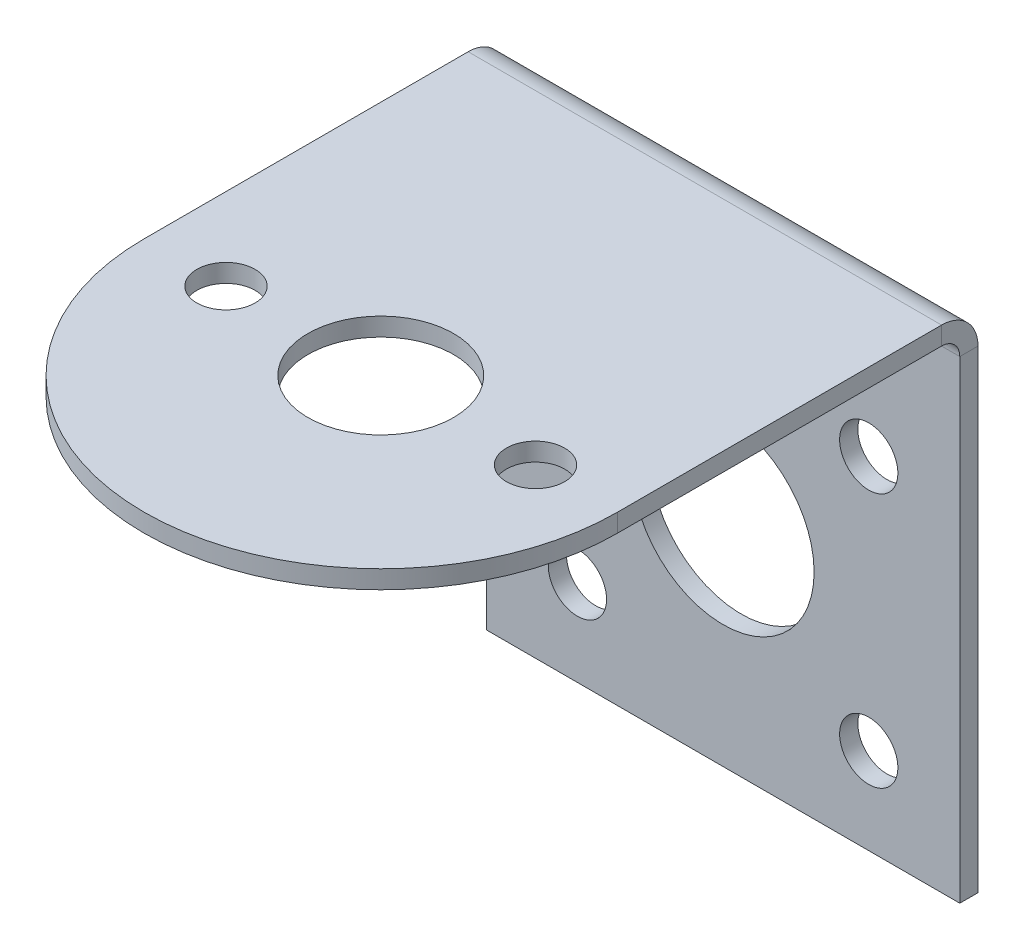
ISO-10303-21;
HEADER;
FILE_DESCRIPTION(('STEP AP214'),'2;1');
FILE_NAME('part.step','',(''),(''),'','','');
FILE_SCHEMA(('AUTOMOTIVE_DESIGN { 1 0 10303 214 1 1 1 1 }'));
ENDSEC;
DATA;
#1=APPLICATION_CONTEXT('core data for automotive mechanical design processes');
#2=APPLICATION_PROTOCOL_DEFINITION('international standard','automotive_design',2000,#1);
#3=PRODUCT_CONTEXT('',#1,'mechanical');
#4=PRODUCT('Part','Part','',(#3));
#5=PRODUCT_RELATED_PRODUCT_CATEGORY('part','',(#4));
#6=PRODUCT_DEFINITION_FORMATION('','',#4);
#7=PRODUCT_DEFINITION_CONTEXT('part definition',#1,'design');
#8=PRODUCT_DEFINITION('design','',#6,#7);
#9=PRODUCT_DEFINITION_SHAPE('','',#8);
#10=(LENGTH_UNIT() NAMED_UNIT(*) SI_UNIT(.MILLI.,.METRE.));
#11=(NAMED_UNIT(*) PLANE_ANGLE_UNIT() SI_UNIT($,.RADIAN.));
#12=(NAMED_UNIT(*) SI_UNIT($,.STERADIAN.) SOLID_ANGLE_UNIT());
#13=UNCERTAINTY_MEASURE_WITH_UNIT(LENGTH_MEASURE(1.E-05),#10,'distance_accuracy_value','');
#14=(GEOMETRIC_REPRESENTATION_CONTEXT(3) GLOBAL_UNCERTAINTY_ASSIGNED_CONTEXT((#13)) GLOBAL_UNIT_ASSIGNED_CONTEXT((#10,
#11,#12)) REPRESENTATION_CONTEXT('',''));
#15=CARTESIAN_POINT('',(0.,0.,0.));
#16=DIRECTION('',(0.,0.,1.));
#17=DIRECTION('',(1.,0.,0.));
#18=AXIS2_PLACEMENT_3D('',#15,#16,#17);
#19=CARTESIAN_POINT('',(0.,2.,19.8008851424871));
#20=DIRECTION('',(0.,-1.,0.));
#21=DIRECTION('',(-1.,0.,0.));
#22=AXIS2_PLACEMENT_3D('',#19,#20,#21);
#23=CYLINDRICAL_SURFACE('',#22,4.);
#24=CARTESIAN_POINT('',(0.,2.,19.8008851424871));
#25=DIRECTION('',(0.,-1.,0.));
#26=DIRECTION('',(-1.,0.,0.));
#27=AXIS2_PLACEMENT_3D('',#24,#25,#26);
#28=CIRCLE('',#27,4.);
#29=CARTESIAN_POINT('',(4.,2.,19.8008851424871));
#30=VERTEX_POINT('',#29);
#31=EDGE_CURVE('E164',#30,#30,#28,.T.);
#32=ORIENTED_EDGE('',*,*,#31,.F.);
#33=DIRECTION('',(0.,-1.,0.));
#34=VECTOR('',#33,1.);
#35=CARTESIAN_POINT('',(4.,2.,19.8008851424871));
#36=LINE('',#35,#34);
#37=CARTESIAN_POINT('',(4.,1.,19.8008851424871));
#38=VERTEX_POINT('',#37);
#39=EDGE_CURVE('E11',#30,#38,#36,.T.);
#40=ORIENTED_EDGE('',*,*,#39,.T.);
#41=CARTESIAN_POINT('',(0.,1.,19.8008851424871));
#42=DIRECTION('',(0.,1.,0.));
#43=DIRECTION('',(-1.,0.,0.));
#44=AXIS2_PLACEMENT_3D('',#41,#42,#43);
#45=CIRCLE('',#44,4.);
#46=EDGE_CURVE('E218',#38,#38,#45,.T.);
#47=ORIENTED_EDGE('',*,*,#46,.F.);
#48=ORIENTED_EDGE('',*,*,#39,.F.);
#49=EDGE_LOOP('',(#32,#40,#47,#48));
#50=FACE_BOUND('',#49,.T.);
#51=ADVANCED_FACE('F38',(#50),#23,.F.);
#52=CARTESIAN_POINT('',(8.5,2.,19.8008851424871));
#53=DIRECTION('',(0.,-1.,0.));
#54=DIRECTION('',(-1.,0.,0.));
#55=AXIS2_PLACEMENT_3D('',#52,#53,#54);
#56=CYLINDRICAL_SURFACE('',#55,1.6);
#57=CARTESIAN_POINT('',(8.5,2.,19.8008851424871));
#58=DIRECTION('',(0.,-1.,0.));
#59=DIRECTION('',(-1.,0.,0.));
#60=AXIS2_PLACEMENT_3D('',#57,#58,#59);
#61=CIRCLE('',#60,1.6);
#62=CARTESIAN_POINT('',(10.1,2.,19.8008851424871));
#63=VERTEX_POINT('',#62);
#64=EDGE_CURVE('E232',#63,#63,#61,.T.);
#65=ORIENTED_EDGE('',*,*,#64,.F.);
#66=DIRECTION('',(0.,-1.,0.));
#67=VECTOR('',#66,1.);
#68=CARTESIAN_POINT('',(10.1,2.,19.8008851424871));
#69=LINE('',#68,#67);
#70=CARTESIAN_POINT('',(10.1,1.,19.8008851424871));
#71=VERTEX_POINT('',#70);
#72=EDGE_CURVE('E48',#63,#71,#69,.T.);
#73=ORIENTED_EDGE('',*,*,#72,.T.);
#74=CARTESIAN_POINT('',(8.5,1.,19.8008851424871));
#75=DIRECTION('',(0.,1.,0.));
#76=DIRECTION('',(-1.,0.,0.));
#77=AXIS2_PLACEMENT_3D('',#74,#75,#76);
#78=CIRCLE('',#77,1.6);
#79=EDGE_CURVE('E271',#71,#71,#78,.T.);
#80=ORIENTED_EDGE('',*,*,#79,.F.);
#81=ORIENTED_EDGE('',*,*,#72,.F.);
#82=EDGE_LOOP('',(#65,#73,#80,#81));
#83=FACE_BOUND('',#82,.T.);
#84=ADVANCED_FACE('F356',(#83),#56,.F.);
#85=CARTESIAN_POINT('',(-8.5,2.,19.8008851424871));
#86=DIRECTION('',(0.,-1.,0.));
#87=DIRECTION('',(-1.,0.,0.));
#88=AXIS2_PLACEMENT_3D('',#85,#86,#87);
#89=CYLINDRICAL_SURFACE('',#88,1.6);
#90=CARTESIAN_POINT('',(-8.5,2.,19.8008851424871));
#91=DIRECTION('',(0.,-1.,0.));
#92=DIRECTION('',(-1.,0.,0.));
#93=AXIS2_PLACEMENT_3D('',#90,#91,#92);
#94=CIRCLE('',#93,1.6);
#95=CARTESIAN_POINT('',(-6.9,2.,19.8008851424871));
#96=VERTEX_POINT('',#95);
#97=EDGE_CURVE('E174',#96,#96,#94,.T.);
#98=ORIENTED_EDGE('',*,*,#97,.F.);
#99=DIRECTION('',(0.,-1.,0.));
#100=VECTOR('',#99,1.);
#101=CARTESIAN_POINT('',(-6.9,2.,19.8008851424871));
#102=LINE('',#101,#100);
#103=CARTESIAN_POINT('',(-6.9,1.,19.8008851424871));
#104=VERTEX_POINT('',#103);
#105=EDGE_CURVE('E249',#96,#104,#102,.T.);
#106=ORIENTED_EDGE('',*,*,#105,.T.);
#107=CARTESIAN_POINT('',(-8.5,1.,19.8008851424871));
#108=DIRECTION('',(0.,1.,0.));
#109=DIRECTION('',(-1.,0.,0.));
#110=AXIS2_PLACEMENT_3D('',#107,#108,#109);
#111=CIRCLE('',#110,1.6);
#112=EDGE_CURVE('E273',#104,#104,#111,.T.);
#113=ORIENTED_EDGE('',*,*,#112,.F.);
#114=ORIENTED_EDGE('',*,*,#105,.F.);
#115=EDGE_LOOP('',(#98,#106,#113,#114));
#116=FACE_BOUND('',#115,.T.);
#117=ADVANCED_FACE('F361',(#116),#89,.F.);
#118=CARTESIAN_POINT('',(13.0000000000037,2.,-26.1991148575129));
#119=DIRECTION('',(1.,0.,0.));
#120=DIRECTION('',(0.,-1.,0.));
#121=AXIS2_PLACEMENT_3D('',#118,#119,#120);
#122=PLANE('',#121);
#123=DIRECTION('',(0.,1.,0.));
#124=VECTOR('',#123,1.);
#125=CARTESIAN_POINT('',(13.0000000000037,1.,2.));
#126=LINE('',#125,#124);
#127=CARTESIAN_POINT('',(13.0000000000037,1.,2.));
#128=VERTEX_POINT('',#127);
#129=CARTESIAN_POINT('',(13.0000000000037,2.,2.));
#130=VERTEX_POINT('',#129);
#131=EDGE_CURVE('E152',#128,#130,#126,.T.);
#132=ORIENTED_EDGE('',*,*,#131,.T.);
#133=DIRECTION('',(0.,0.,1.));
#134=VECTOR('',#133,1.);
#135=CARTESIAN_POINT('',(13.0000000000037,2.,2.));
#136=LINE('',#135,#134);
#137=CARTESIAN_POINT('',(13.,2.,19.8008851424888));
#138=VERTEX_POINT('',#137);
#139=EDGE_CURVE('E155',#130,#138,#136,.T.);
#140=ORIENTED_EDGE('',*,*,#139,.T.);
#141=DIRECTION('',(0.,-1.,0.));
#142=VECTOR('',#141,1.);
#143=CARTESIAN_POINT('',(13.0000000000019,2.,19.8008851424888));
#144=LINE('',#143,#142);
#145=CARTESIAN_POINT('',(13.,1.,19.8008851424888));
#146=VERTEX_POINT('',#145);
#147=EDGE_CURVE('E217',#138,#146,#144,.T.);
#148=ORIENTED_EDGE('',*,*,#147,.T.);
#149=DIRECTION('',(0.,0.,1.));
#150=VECTOR('',#149,1.);
#151=CARTESIAN_POINT('',(13.0000000000037,1.,2.));
#152=LINE('',#151,#150);
#153=EDGE_CURVE('E158',#128,#146,#152,.T.);
#154=ORIENTED_EDGE('',*,*,#153,.F.);
#155=EDGE_LOOP('',(#132,#140,#148,#154));
#156=FACE_BOUND('',#155,.T.);
#157=ADVANCED_FACE('F154',(#156),#122,.T.);
#158=CARTESIAN_POINT('',(0.,2.,19.8008851424871));
#159=DIRECTION('',(0.,-1.,0.));
#160=DIRECTION('',(1.,0.,1.25984692763618E-13));
#161=AXIS2_PLACEMENT_3D('',#158,#159,#160);
#162=CYLINDRICAL_SURFACE('',#161,13.);
#163=CARTESIAN_POINT('',(0.,2.,19.8008851424871));
#164=DIRECTION('',(0.,-1.,0.));
#165=DIRECTION('',(1.,0.,1.25984692763618E-13));
#166=AXIS2_PLACEMENT_3D('',#163,#164,#165);
#167=CIRCLE('',#166,13.);
#168=CARTESIAN_POINT('',(-13.0000000000037,2.,19.8008851424888));
#169=VERTEX_POINT('',#168);
#170=EDGE_CURVE('E173',#138,#169,#167,.T.);
#171=ORIENTED_EDGE('',*,*,#170,.T.);
#172=DIRECTION('',(0.,-1.,0.));
#173=VECTOR('',#172,1.);
#174=CARTESIAN_POINT('',(-13.0000000000019,2.,19.800885142488));
#175=LINE('',#174,#173);
#176=CARTESIAN_POINT('',(-13.0000000000037,1.,19.8008851424888));
#177=VERTEX_POINT('',#176);
#178=EDGE_CURVE('E215',#169,#177,#175,.T.);
#179=ORIENTED_EDGE('',*,*,#178,.T.);
#180=CARTESIAN_POINT('',(0.,1.,19.8008851424871));
#181=DIRECTION('',(0.,-1.,0.));
#182=DIRECTION('',(1.,0.,1.25984692763618E-13));
#183=AXIS2_PLACEMENT_3D('',#180,#181,#182);
#184=CIRCLE('',#183,13.);
#185=EDGE_CURVE('E206',#146,#177,#184,.T.);
#186=ORIENTED_EDGE('',*,*,#185,.F.);
#187=ORIENTED_EDGE('',*,*,#147,.F.);
#188=EDGE_LOOP('',(#171,#179,#186,#187));
#189=FACE_BOUND('',#188,.T.);
#190=ADVANCED_FACE('F319',(#189),#162,.T.);
#191=CARTESIAN_POINT('',(-13.0000000000037,2.,19.8008851424888));
#192=DIRECTION('',(-1.,0.,0.));
#193=DIRECTION('',(0.,0.,1.));
#194=AXIS2_PLACEMENT_3D('',#191,#192,#193);
#195=PLANE('',#194);
#196=DIRECTION('',(0.,1.,0.));
#197=VECTOR('',#196,1.);
#198=CARTESIAN_POINT('',(-13.0000000000037,1.,2.));
#199=LINE('',#198,#197);
#200=CARTESIAN_POINT('',(-13.0000000000037,1.,2.));
#201=VERTEX_POINT('',#200);
#202=CARTESIAN_POINT('',(-13.0000000000037,2.,2.));
#203=VERTEX_POINT('',#202);
#204=EDGE_CURVE('E163',#201,#203,#199,.T.);
#205=ORIENTED_EDGE('',*,*,#204,.F.);
#206=DIRECTION('',(0.,0.,-1.));
#207=VECTOR('',#206,1.);
#208=CARTESIAN_POINT('',(-13.0000000000037,1.,19.8008851424888));
#209=LINE('',#208,#207);
#210=EDGE_CURVE('E192',#177,#201,#209,.T.);
#211=ORIENTED_EDGE('',*,*,#210,.F.);
#212=ORIENTED_EDGE('',*,*,#178,.F.);
#213=DIRECTION('',(0.,0.,-1.));
#214=VECTOR('',#213,1.);
#215=CARTESIAN_POINT('',(-13.0000000000037,2.,19.8008851424888));
#216=LINE('',#215,#214);
#217=EDGE_CURVE('E235',#169,#203,#216,.T.);
#218=ORIENTED_EDGE('',*,*,#217,.T.);
#219=EDGE_LOOP('',(#205,#211,#212,#218));
#220=FACE_BOUND('',#219,.T.);
#221=ADVANCED_FACE('F321',(#220),#195,.T.);
#222=CARTESIAN_POINT('',(0.,1.,-0.199114857512855));
#223=DIRECTION('',(0.,-1.,0.));
#224=DIRECTION('',(-1.,0.,0.));
#225=AXIS2_PLACEMENT_3D('',#222,#223,#224);
#226=PLANE('',#225);
#227=ORIENTED_EDGE('',*,*,#46,.T.);
#228=EDGE_LOOP('',(#227));
#229=FACE_BOUND('',#228,.T.);
#230=ORIENTED_EDGE('',*,*,#79,.T.);
#231=EDGE_LOOP('',(#230));
#232=FACE_BOUND('',#231,.T.);
#233=ORIENTED_EDGE('',*,*,#112,.T.);
#234=EDGE_LOOP('',(#233));
#235=FACE_BOUND('',#234,.T.);
#236=DIRECTION('',(1.,0.,0.));
#237=VECTOR('',#236,1.);
#238=CARTESIAN_POINT('',(-13.0000000000037,1.,2.));
#239=LINE('',#238,#237);
#240=EDGE_CURVE('E200',#201,#128,#239,.T.);
#241=ORIENTED_EDGE('',*,*,#240,.T.);
#242=ORIENTED_EDGE('',*,*,#153,.T.);
#243=ORIENTED_EDGE('',*,*,#185,.T.);
#244=ORIENTED_EDGE('',*,*,#210,.T.);
#245=EDGE_LOOP('',(#241,#242,#243,#244));
#246=FACE_BOUND('',#245,.T.);
#247=ADVANCED_FACE('F314',(#229,#232,#235,#246),#226,.T.);
#248=CARTESIAN_POINT('',(-13.0000000000037,0.,1.));
#249=DIRECTION('',(-1.,0.,0.));
#250=DIRECTION('',(0.,1.,0.));
#251=AXIS2_PLACEMENT_3D('',#248,#249,#250);
#252=PLANE('',#251);
#253=CARTESIAN_POINT('',(-13.0000000000037,0.,2.));
#254=DIRECTION('',(-1.,0.,0.));
#255=DIRECTION('',(0.,1.,0.));
#256=AXIS2_PLACEMENT_3D('',#253,#254,#255);
#257=CIRCLE('',#256,1.);
#258=CARTESIAN_POINT('',(-13.0000000000037,0.,1.));
#259=VERTEX_POINT('',#258);
#260=EDGE_CURVE('E203',#201,#259,#257,.T.);
#261=ORIENTED_EDGE('',*,*,#260,.F.);
#262=ORIENTED_EDGE('',*,*,#204,.T.);
#263=CARTESIAN_POINT('',(-13.0000000000037,0.,2.00000000000005));
#264=DIRECTION('',(-1.,0.,0.));
#265=DIRECTION('',(0.,1.,0.));
#266=AXIS2_PLACEMENT_3D('',#263,#264,#265);
#267=CIRCLE('',#266,2.);
#268=CARTESIAN_POINT('',(-13.0000000000037,0.,0.));
#269=VERTEX_POINT('',#268);
#270=EDGE_CURVE('E184',#203,#269,#267,.T.);
#271=ORIENTED_EDGE('',*,*,#270,.T.);
#272=DIRECTION('',(0.,0.,-1.));
#273=VECTOR('',#272,1.);
#274=CARTESIAN_POINT('',(-13.0000000000037,0.,1.));
#275=LINE('',#274,#273);
#276=EDGE_CURVE('E204',#259,#269,#275,.T.);
#277=ORIENTED_EDGE('',*,*,#276,.F.);
#278=EDGE_LOOP('',(#261,#262,#271,#277));
#279=FACE_BOUND('',#278,.T.);
#280=ADVANCED_FACE('F325',(#279),#252,.T.);
#281=CARTESIAN_POINT('',(13.0000000000037,0.,0.));
#282=DIRECTION('',(1.,0.,0.));
#283=DIRECTION('',(0.,-1.,0.));
#284=AXIS2_PLACEMENT_3D('',#281,#282,#283);
#285=PLANE('',#284);
#286=CARTESIAN_POINT('',(13.0000000000037,0.,2.));
#287=DIRECTION('',(1.,0.,0.));
#288=DIRECTION('',(0.,0.,-1.));
#289=AXIS2_PLACEMENT_3D('',#286,#287,#288);
#290=CIRCLE('',#289,2.);
#291=CARTESIAN_POINT('',(13.0000000000037,0.,0.));
#292=VERTEX_POINT('',#291);
#293=EDGE_CURVE('E177',#292,#130,#290,.T.);
#294=ORIENTED_EDGE('',*,*,#293,.T.);
#295=ORIENTED_EDGE('',*,*,#131,.F.);
#296=CARTESIAN_POINT('',(13.0000000000037,0.,2.));
#297=DIRECTION('',(1.,0.,0.));
#298=DIRECTION('',(0.,0.,-1.));
#299=AXIS2_PLACEMENT_3D('',#296,#297,#298);
#300=CIRCLE('',#299,1.);
#301=CARTESIAN_POINT('',(13.0000000000037,0.,1.));
#302=VERTEX_POINT('',#301);
#303=EDGE_CURVE('E233',#302,#128,#300,.T.);
#304=ORIENTED_EDGE('',*,*,#303,.F.);
#305=DIRECTION('',(0.,0.,-1.));
#306=VECTOR('',#305,1.);
#307=CARTESIAN_POINT('',(13.0000000000037,0.,1.));
#308=LINE('',#307,#306);
#309=EDGE_CURVE('E180',#302,#292,#308,.T.);
#310=ORIENTED_EDGE('',*,*,#309,.T.);
#311=EDGE_LOOP('',(#294,#295,#304,#310));
#312=FACE_BOUND('',#311,.T.);
#313=ADVANCED_FACE('F178',(#312),#285,.T.);
#314=CARTESIAN_POINT('',(0.,2.,-0.199114857512855));
#315=DIRECTION('',(0.,-1.,0.));
#316=DIRECTION('',(-1.,0.,0.));
#317=AXIS2_PLACEMENT_3D('',#314,#315,#316);
#318=PLANE('',#317);
#319=ORIENTED_EDGE('',*,*,#31,.T.);
#320=EDGE_LOOP('',(#319));
#321=FACE_BOUND('',#320,.T.);
#322=ORIENTED_EDGE('',*,*,#64,.T.);
#323=EDGE_LOOP('',(#322));
#324=FACE_BOUND('',#323,.T.);
#325=ORIENTED_EDGE('',*,*,#97,.T.);
#326=EDGE_LOOP('',(#325));
#327=FACE_BOUND('',#326,.T.);
#328=DIRECTION('',(1.,0.,0.));
#329=VECTOR('',#328,1.);
#330=CARTESIAN_POINT('',(-13.0000000000037,2.,2.));
#331=LINE('',#330,#329);
#332=EDGE_CURVE('E171',#203,#130,#331,.T.);
#333=ORIENTED_EDGE('',*,*,#332,.F.);
#334=ORIENTED_EDGE('',*,*,#217,.F.);
#335=ORIENTED_EDGE('',*,*,#170,.F.);
#336=ORIENTED_EDGE('',*,*,#139,.F.);
#337=EDGE_LOOP('',(#333,#334,#335,#336));
#338=FACE_BOUND('',#337,.T.);
#339=ADVANCED_FACE('F168',(#321,#324,#327,#338),#318,.F.);
#340=CARTESIAN_POINT('',(-13.0000000000037,0.,2.));
#341=DIRECTION('',(-1.,0.,0.));
#342=DIRECTION('',(0.,0.,-1.));
#343=AXIS2_PLACEMENT_3D('',#340,#341,#342);
#344=CYLINDRICAL_SURFACE('',#343,1.);
#345=ORIENTED_EDGE('',*,*,#240,.F.);
#346=ORIENTED_EDGE('',*,*,#260,.T.);
#347=DIRECTION('',(1.,0.,0.));
#348=VECTOR('',#347,1.);
#349=CARTESIAN_POINT('',(-13.0000000000037,0.,1.));
#350=LINE('',#349,#348);
#351=EDGE_CURVE('E42',#259,#302,#350,.T.);
#352=ORIENTED_EDGE('',*,*,#351,.T.);
#353=ORIENTED_EDGE('',*,*,#303,.T.);
#354=EDGE_LOOP('',(#345,#346,#352,#353));
#355=FACE_BOUND('',#354,.T.);
#356=ADVANCED_FACE('F328',(#355),#344,.F.);
#357=CARTESIAN_POINT('',(-13.0000000000037,20.0000000000016,0.));
#358=DIRECTION('',(-1.,0.,0.));
#359=DIRECTION('',(0.,0.,1.));
#360=AXIS2_PLACEMENT_3D('',#357,#358,#359);
#361=PLANE('',#360);
#362=ORIENTED_EDGE('',*,*,#276,.T.);
#363=DIRECTION('',(0.,-1.,0.));
#364=VECTOR('',#363,1.);
#365=CARTESIAN_POINT('',(-13.0000000000037,0.,0.));
#366=LINE('',#365,#364);
#367=CARTESIAN_POINT('',(-13.,-26.,0.));
#368=VERTEX_POINT('',#367);
#369=EDGE_CURVE('E210',#269,#368,#366,.T.);
#370=ORIENTED_EDGE('',*,*,#369,.T.);
#371=DIRECTION('',(0.,0.,1.));
#372=VECTOR('',#371,1.);
#373=CARTESIAN_POINT('',(-13.0000000000019,-26.,0.));
#374=LINE('',#373,#372);
#375=CARTESIAN_POINT('',(-13.,-26.,1.));
#376=VERTEX_POINT('',#375);
#377=EDGE_CURVE('E257',#368,#376,#374,.T.);
#378=ORIENTED_EDGE('',*,*,#377,.T.);
#379=DIRECTION('',(0.,-1.,0.));
#380=VECTOR('',#379,1.);
#381=CARTESIAN_POINT('',(-13.0000000000037,0.,1.));
#382=LINE('',#381,#380);
#383=EDGE_CURVE('E219',#259,#376,#382,.T.);
#384=ORIENTED_EDGE('',*,*,#383,.F.);
#385=EDGE_LOOP('',(#362,#370,#378,#384));
#386=FACE_BOUND('',#385,.T.);
#387=ADVANCED_FACE('F393',(#386),#361,.T.);
#388=CARTESIAN_POINT('',(-13.,-26.,0.));
#389=DIRECTION('',(0.,-1.,0.));
#390=DIRECTION('',(0.,0.,-1.));
#391=AXIS2_PLACEMENT_3D('',#388,#389,#390);
#392=PLANE('',#391);
#393=DIRECTION('',(1.,0.,0.));
#394=VECTOR('',#393,1.);
#395=CARTESIAN_POINT('',(-13.,-26.,0.));
#396=LINE('',#395,#394);
#397=CARTESIAN_POINT('',(13.0000000000037,-26.,0.));
#398=VERTEX_POINT('',#397);
#399=EDGE_CURVE('E207',#368,#398,#396,.T.);
#400=ORIENTED_EDGE('',*,*,#399,.T.);
#401=DIRECTION('',(0.,0.,1.));
#402=VECTOR('',#401,1.);
#403=CARTESIAN_POINT('',(13.0000000000019,-26.,0.));
#404=LINE('',#403,#402);
#405=CARTESIAN_POINT('',(13.0000000000037,-26.,1.));
#406=VERTEX_POINT('',#405);
#407=EDGE_CURVE('E255',#398,#406,#404,.T.);
#408=ORIENTED_EDGE('',*,*,#407,.T.);
#409=DIRECTION('',(1.,0.,0.));
#410=VECTOR('',#409,1.);
#411=CARTESIAN_POINT('',(-13.,-26.,1.));
#412=LINE('',#411,#410);
#413=EDGE_CURVE('E222',#376,#406,#412,.T.);
#414=ORIENTED_EDGE('',*,*,#413,.F.);
#415=ORIENTED_EDGE('',*,*,#377,.F.);
#416=EDGE_LOOP('',(#400,#408,#414,#415));
#417=FACE_BOUND('',#416,.T.);
#418=ADVANCED_FACE('F388',(#417),#392,.T.);
#419=CARTESIAN_POINT('',(13.0000000000037,-26.,0.));
#420=DIRECTION('',(1.,0.,0.));
#421=DIRECTION('',(0.,-1.,0.));
#422=AXIS2_PLACEMENT_3D('',#419,#420,#421);
#423=PLANE('',#422);
#424=ORIENTED_EDGE('',*,*,#309,.F.);
#425=DIRECTION('',(0.,1.,0.));
#426=VECTOR('',#425,1.);
#427=CARTESIAN_POINT('',(13.0000000000037,-26.,1.));
#428=LINE('',#427,#426);
#429=EDGE_CURVE('E264',#406,#302,#428,.T.);
#430=ORIENTED_EDGE('',*,*,#429,.F.);
#431=ORIENTED_EDGE('',*,*,#407,.F.);
#432=DIRECTION('',(0.,1.,0.));
#433=VECTOR('',#432,1.);
#434=CARTESIAN_POINT('',(13.0000000000037,-26.,0.));
#435=LINE('',#434,#433);
#436=EDGE_CURVE('E211',#398,#292,#435,.T.);
#437=ORIENTED_EDGE('',*,*,#436,.T.);
#438=EDGE_LOOP('',(#424,#430,#431,#437));
#439=FACE_BOUND('',#438,.T.);
#440=ADVANCED_FACE('F380',(#439),#423,.T.);
#441=CARTESIAN_POINT('',(13.0000000000037,0.,2.));
#442=DIRECTION('',(1.,0.,0.));
#443=DIRECTION('',(0.,0.,-1.));
#444=AXIS2_PLACEMENT_3D('',#441,#442,#443);
#445=CYLINDRICAL_SURFACE('',#444,2.);
#446=ORIENTED_EDGE('',*,*,#332,.T.);
#447=ORIENTED_EDGE('',*,*,#293,.F.);
#448=DIRECTION('',(1.,0.,0.));
#449=VECTOR('',#448,1.);
#450=CARTESIAN_POINT('',(-13.0000000000037,0.,0.));
#451=LINE('',#450,#449);
#452=EDGE_CURVE('E259',#269,#292,#451,.T.);
#453=ORIENTED_EDGE('',*,*,#452,.F.);
#454=ORIENTED_EDGE('',*,*,#270,.F.);
#455=EDGE_LOOP('',(#446,#447,#453,#454));
#456=FACE_BOUND('',#455,.T.);
#457=ADVANCED_FACE('F187',(#456),#445,.T.);
#458=CARTESIAN_POINT('',(1.39802406775861E-12,-14.25,0.));
#459=DIRECTION('',(0.,0.,1.));
#460=DIRECTION('',(-1.,0.,0.));
#461=AXIS2_PLACEMENT_3D('',#458,#459,#460);
#462=CYLINDRICAL_SURFACE('',#461,5.);
#463=CARTESIAN_POINT('',(1.39802406775861E-12,-14.25,0.));
#464=DIRECTION('',(0.,0.,1.));
#465=DIRECTION('',(-1.,0.,0.));
#466=AXIS2_PLACEMENT_3D('',#463,#464,#465);
#467=CIRCLE('',#466,5.);
#468=CARTESIAN_POINT('',(5.0000000000014,-14.25,0.));
#469=VERTEX_POINT('',#468);
#470=EDGE_CURVE('E245',#469,#469,#467,.T.);
#471=ORIENTED_EDGE('',*,*,#470,.F.);
#472=DIRECTION('',(0.,0.,1.));
#473=VECTOR('',#472,1.);
#474=CARTESIAN_POINT('',(5.0000000000014,-14.25,0.));
#475=LINE('',#474,#473);
#476=CARTESIAN_POINT('',(5.0000000000014,-14.25,1.));
#477=VERTEX_POINT('',#476);
#478=EDGE_CURVE('E141',#469,#477,#475,.T.);
#479=ORIENTED_EDGE('',*,*,#478,.T.);
#480=CARTESIAN_POINT('',(1.39802406775861E-12,-14.25,1.));
#481=DIRECTION('',(0.,0.,-1.));
#482=DIRECTION('',(-1.,0.,0.));
#483=AXIS2_PLACEMENT_3D('',#480,#481,#482);
#484=CIRCLE('',#483,5.);
#485=EDGE_CURVE('E229',#477,#477,#484,.T.);
#486=ORIENTED_EDGE('',*,*,#485,.F.);
#487=ORIENTED_EDGE('',*,*,#478,.F.);
#488=EDGE_LOOP('',(#471,#479,#486,#487));
#489=FACE_BOUND('',#488,.T.);
#490=ADVANCED_FACE('F287',(#489),#462,.F.);
#491=CARTESIAN_POINT('',(8.0000000000014,-21.25,0.));
#492=DIRECTION('',(0.,0.,1.));
#493=DIRECTION('',(-1.,0.,0.));
#494=AXIS2_PLACEMENT_3D('',#491,#492,#493);
#495=CYLINDRICAL_SURFACE('',#494,1.6);
#496=CARTESIAN_POINT('',(8.0000000000014,-21.25,0.));
#497=DIRECTION('',(0.,0.,1.));
#498=DIRECTION('',(-1.,0.,0.));
#499=AXIS2_PLACEMENT_3D('',#496,#497,#498);
#500=CIRCLE('',#499,1.6);
#501=CARTESIAN_POINT('',(9.6000000000014,-21.25,0.));
#502=VERTEX_POINT('',#501);
#503=EDGE_CURVE('E254',#502,#502,#500,.T.);
#504=ORIENTED_EDGE('',*,*,#503,.F.);
#505=DIRECTION('',(0.,0.,1.));
#506=VECTOR('',#505,1.);
#507=CARTESIAN_POINT('',(9.6000000000014,-21.25,0.));
#508=LINE('',#507,#506);
#509=CARTESIAN_POINT('',(9.6000000000014,-21.25,1.));
#510=VERTEX_POINT('',#509);
#511=EDGE_CURVE('E133',#502,#510,#508,.T.);
#512=ORIENTED_EDGE('',*,*,#511,.T.);
#513=CARTESIAN_POINT('',(8.0000000000014,-21.25,1.));
#514=DIRECTION('',(0.,0.,-1.));
#515=DIRECTION('',(-1.,0.,0.));
#516=AXIS2_PLACEMENT_3D('',#513,#514,#515);
#517=CIRCLE('',#516,1.6);
#518=EDGE_CURVE('E226',#510,#510,#517,.T.);
#519=ORIENTED_EDGE('',*,*,#518,.F.);
#520=ORIENTED_EDGE('',*,*,#511,.F.);
#521=EDGE_LOOP('',(#504,#512,#519,#520));
#522=FACE_BOUND('',#521,.T.);
#523=ADVANCED_FACE('F345',(#522),#495,.F.);
#524=CARTESIAN_POINT('',(-7.9999999999986,-21.25,0.));
#525=DIRECTION('',(0.,0.,1.));
#526=DIRECTION('',(-1.,0.,0.));
#527=AXIS2_PLACEMENT_3D('',#524,#525,#526);
#528=CYLINDRICAL_SURFACE('',#527,1.6);
#529=CARTESIAN_POINT('',(-7.9999999999986,-21.25,0.));
#530=DIRECTION('',(0.,0.,1.));
#531=DIRECTION('',(-1.,0.,0.));
#532=AXIS2_PLACEMENT_3D('',#529,#530,#531);
#533=CIRCLE('',#532,1.6);
#534=CARTESIAN_POINT('',(-6.3999999999986,-21.25,0.));
#535=VERTEX_POINT('',#534);
#536=EDGE_CURVE('E199',#535,#535,#533,.T.);
#537=ORIENTED_EDGE('',*,*,#536,.F.);
#538=DIRECTION('',(0.,0.,1.));
#539=VECTOR('',#538,1.);
#540=CARTESIAN_POINT('',(-6.3999999999986,-21.25,0.));
#541=LINE('',#540,#539);
#542=CARTESIAN_POINT('',(-6.3999999999986,-21.25,1.));
#543=VERTEX_POINT('',#542);
#544=EDGE_CURVE('E212',#535,#543,#541,.T.);
#545=ORIENTED_EDGE('',*,*,#544,.T.);
#546=CARTESIAN_POINT('',(-7.9999999999986,-21.25,1.));
#547=DIRECTION('',(0.,0.,-1.));
#548=DIRECTION('',(-1.,0.,0.));
#549=AXIS2_PLACEMENT_3D('',#546,#547,#548);
#550=CIRCLE('',#549,1.6);
#551=EDGE_CURVE('E228',#543,#543,#550,.T.);
#552=ORIENTED_EDGE('',*,*,#551,.F.);
#553=ORIENTED_EDGE('',*,*,#544,.F.);
#554=EDGE_LOOP('',(#537,#545,#552,#553));
#555=FACE_BOUND('',#554,.T.);
#556=ADVANCED_FACE('F366',(#555),#528,.F.);
#557=CARTESIAN_POINT('',(-7.9999999999986,-7.25000000000008,0.));
#558=DIRECTION('',(0.,0.,1.));
#559=DIRECTION('',(-1.,0.,0.));
#560=AXIS2_PLACEMENT_3D('',#557,#558,#559);
#561=CYLINDRICAL_SURFACE('',#560,1.6);
#562=CARTESIAN_POINT('',(-7.9999999999986,-7.25000000000008,0.));
#563=DIRECTION('',(0.,0.,1.));
#564=DIRECTION('',(-1.,0.,0.));
#565=AXIS2_PLACEMENT_3D('',#562,#563,#564);
#566=CIRCLE('',#565,1.6);
#567=CARTESIAN_POINT('',(-6.3999999999986,-7.25000000000008,0.));
#568=VERTEX_POINT('',#567);
#569=EDGE_CURVE('E195',#568,#568,#566,.T.);
#570=ORIENTED_EDGE('',*,*,#569,.F.);
#571=DIRECTION('',(0.,0.,1.));
#572=VECTOR('',#571,1.);
#573=CARTESIAN_POINT('',(-6.3999999999986,-7.25000000000008,0.));
#574=LINE('',#573,#572);
#575=CARTESIAN_POINT('',(-6.3999999999986,-7.25000000000008,1.));
#576=VERTEX_POINT('',#575);
#577=EDGE_CURVE('E214',#568,#576,#574,.T.);
#578=ORIENTED_EDGE('',*,*,#577,.T.);
#579=CARTESIAN_POINT('',(-7.9999999999986,-7.25000000000008,1.));
#580=DIRECTION('',(0.,0.,-1.));
#581=DIRECTION('',(-1.,0.,0.));
#582=AXIS2_PLACEMENT_3D('',#579,#580,#581);
#583=CIRCLE('',#582,1.6);
#584=EDGE_CURVE('E240',#576,#576,#583,.T.);
#585=ORIENTED_EDGE('',*,*,#584,.F.);
#586=ORIENTED_EDGE('',*,*,#577,.F.);
#587=EDGE_LOOP('',(#570,#578,#585,#586));
#588=FACE_BOUND('',#587,.T.);
#589=ADVANCED_FACE('F337',(#588),#561,.F.);
#590=CARTESIAN_POINT('',(8.0000000000014,-7.25000000000009,0.));
#591=DIRECTION('',(0.,0.,1.));
#592=DIRECTION('',(-1.,0.,0.));
#593=AXIS2_PLACEMENT_3D('',#590,#591,#592);
#594=CYLINDRICAL_SURFACE('',#593,1.6);
#595=CARTESIAN_POINT('',(8.0000000000014,-7.25000000000009,0.));
#596=DIRECTION('',(0.,0.,1.));
#597=DIRECTION('',(-1.,0.,0.));
#598=AXIS2_PLACEMENT_3D('',#595,#596,#597);
#599=CIRCLE('',#598,1.6);
#600=CARTESIAN_POINT('',(9.6000000000014,-7.25000000000009,0.));
#601=VERTEX_POINT('',#600);
#602=EDGE_CURVE('E198',#601,#601,#599,.T.);
#603=ORIENTED_EDGE('',*,*,#602,.F.);
#604=DIRECTION('',(0.,0.,1.));
#605=VECTOR('',#604,1.);
#606=CARTESIAN_POINT('',(9.6000000000014,-7.25000000000009,0.));
#607=LINE('',#606,#605);
#608=CARTESIAN_POINT('',(9.6000000000014,-7.25000000000009,1.));
#609=VERTEX_POINT('',#608);
#610=EDGE_CURVE('E225',#601,#609,#607,.T.);
#611=ORIENTED_EDGE('',*,*,#610,.T.);
#612=CARTESIAN_POINT('',(8.0000000000014,-7.25000000000009,1.));
#613=DIRECTION('',(0.,0.,-1.));
#614=DIRECTION('',(-1.,0.,0.));
#615=AXIS2_PLACEMENT_3D('',#612,#613,#614);
#616=CIRCLE('',#615,1.6);
#617=EDGE_CURVE('E238',#609,#609,#616,.T.);
#618=ORIENTED_EDGE('',*,*,#617,.F.);
#619=ORIENTED_EDGE('',*,*,#610,.F.);
#620=EDGE_LOOP('',(#603,#611,#618,#619));
#621=FACE_BOUND('',#620,.T.);
#622=ADVANCED_FACE('F341',(#621),#594,.F.);
#623=CARTESIAN_POINT('',(0.,0.,1.));
#624=DIRECTION('',(0.,0.,1.));
#625=DIRECTION('',(1.,0.,0.));
#626=AXIS2_PLACEMENT_3D('',#623,#624,#625);
#627=PLANE('',#626);
#628=ORIENTED_EDGE('',*,*,#617,.T.);
#629=EDGE_LOOP('',(#628));
#630=FACE_BOUND('',#629,.T.);
#631=ORIENTED_EDGE('',*,*,#584,.T.);
#632=EDGE_LOOP('',(#631));
#633=FACE_BOUND('',#632,.T.);
#634=ORIENTED_EDGE('',*,*,#551,.T.);
#635=EDGE_LOOP('',(#634));
#636=FACE_BOUND('',#635,.T.);
#637=ORIENTED_EDGE('',*,*,#518,.T.);
#638=EDGE_LOOP('',(#637));
#639=FACE_BOUND('',#638,.T.);
#640=ORIENTED_EDGE('',*,*,#485,.T.);
#641=EDGE_LOOP('',(#640));
#642=FACE_BOUND('',#641,.T.);
#643=ORIENTED_EDGE('',*,*,#351,.F.);
#644=ORIENTED_EDGE('',*,*,#383,.T.);
#645=ORIENTED_EDGE('',*,*,#413,.T.);
#646=ORIENTED_EDGE('',*,*,#429,.T.);
#647=EDGE_LOOP('',(#643,#644,#645,#646));
#648=FACE_BOUND('',#647,.T.);
#649=ADVANCED_FACE('F40',(#630,#633,#636,#639,#642,#648),#627,.T.);
#650=CARTESIAN_POINT('',(0.,0.,0.));
#651=DIRECTION('',(0.,0.,1.));
#652=DIRECTION('',(1.,0.,0.));
#653=AXIS2_PLACEMENT_3D('',#650,#651,#652);
#654=PLANE('',#653);
#655=ORIENTED_EDGE('',*,*,#602,.T.);
#656=EDGE_LOOP('',(#655));
#657=FACE_BOUND('',#656,.T.);
#658=ORIENTED_EDGE('',*,*,#569,.T.);
#659=EDGE_LOOP('',(#658));
#660=FACE_BOUND('',#659,.T.);
#661=ORIENTED_EDGE('',*,*,#536,.T.);
#662=EDGE_LOOP('',(#661));
#663=FACE_BOUND('',#662,.T.);
#664=ORIENTED_EDGE('',*,*,#503,.T.);
#665=EDGE_LOOP('',(#664));
#666=FACE_BOUND('',#665,.T.);
#667=ORIENTED_EDGE('',*,*,#470,.T.);
#668=EDGE_LOOP('',(#667));
#669=FACE_BOUND('',#668,.T.);
#670=ORIENTED_EDGE('',*,*,#452,.T.);
#671=ORIENTED_EDGE('',*,*,#436,.F.);
#672=ORIENTED_EDGE('',*,*,#399,.F.);
#673=ORIENTED_EDGE('',*,*,#369,.F.);
#674=EDGE_LOOP('',(#670,#671,#672,#673));
#675=FACE_BOUND('',#674,.T.);
#676=ADVANCED_FACE('F290',(#657,#660,#663,#666,#669,#675),#654,.F.);
#677=CLOSED_SHELL('',(#51,#84,#117,#157,#190,#221,#247,#280,#313,#339,#356,#387,#418,#440,#457,
#490,#523,#556,#589,#622,#649,#676));
#678=MANIFOLD_SOLID_BREP('B2',#677);
#679=ADVANCED_BREP_SHAPE_REPRESENTATION('',(#18,#678),#14);
#680=SHAPE_DEFINITION_REPRESENTATION(#9,#679);
ENDSEC;
END-ISO-10303-21;
